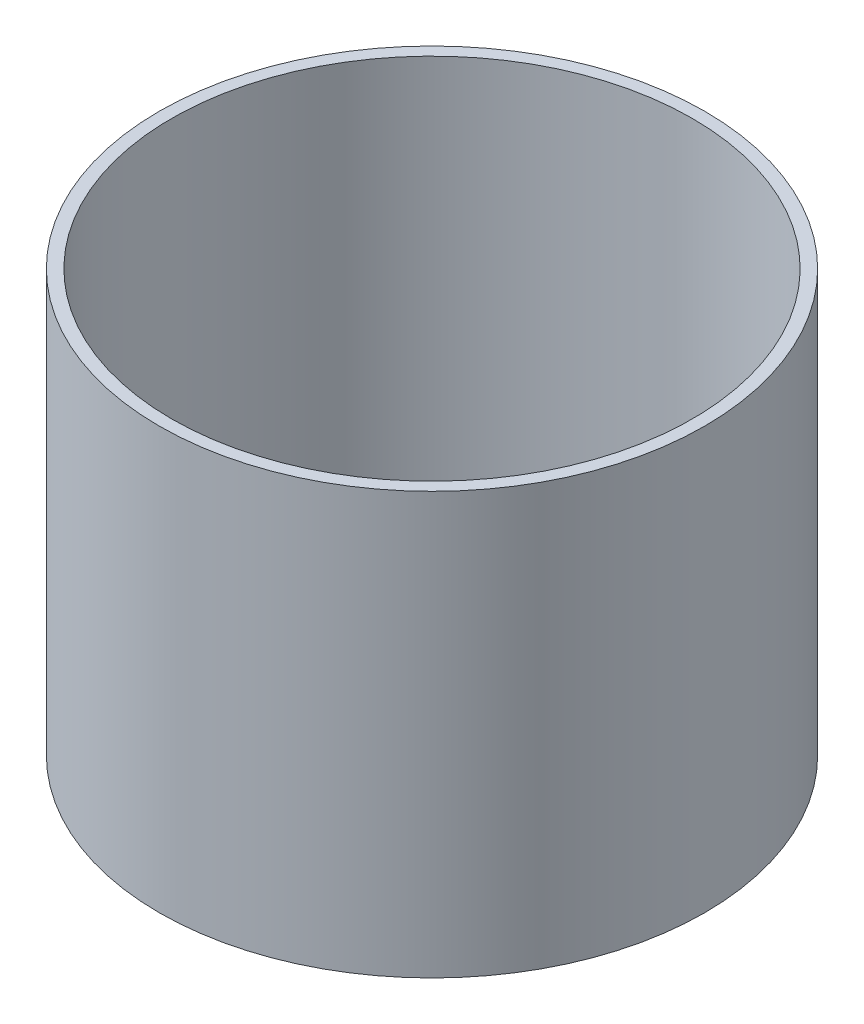
ISO-10303-21;
HEADER;
FILE_DESCRIPTION(('STEP AP214'),'2;1');
FILE_NAME('part.step','',(''),(''),'','','');
FILE_SCHEMA(('AUTOMOTIVE_DESIGN { 1 0 10303 214 1 1 1 1 }'));
ENDSEC;
DATA;
#1=APPLICATION_CONTEXT('core data for automotive mechanical design processes');
#2=APPLICATION_PROTOCOL_DEFINITION('international standard','automotive_design',2000,#1);
#3=PRODUCT_CONTEXT('',#1,'mechanical');
#4=PRODUCT('Part','Part','',(#3));
#5=PRODUCT_RELATED_PRODUCT_CATEGORY('part','',(#4));
#6=PRODUCT_DEFINITION_FORMATION('','',#4);
#7=PRODUCT_DEFINITION_CONTEXT('part definition',#1,'design');
#8=PRODUCT_DEFINITION('design','',#6,#7);
#9=PRODUCT_DEFINITION_SHAPE('','',#8);
#10=(LENGTH_UNIT() NAMED_UNIT(*) SI_UNIT(.MILLI.,.METRE.));
#11=(NAMED_UNIT(*) PLANE_ANGLE_UNIT() SI_UNIT($,.RADIAN.));
#12=(NAMED_UNIT(*) SI_UNIT($,.STERADIAN.) SOLID_ANGLE_UNIT());
#13=UNCERTAINTY_MEASURE_WITH_UNIT(LENGTH_MEASURE(1.E-05),#10,'distance_accuracy_value','');
#14=(GEOMETRIC_REPRESENTATION_CONTEXT(3) GLOBAL_UNCERTAINTY_ASSIGNED_CONTEXT((#13)) GLOBAL_UNIT_ASSIGNED_CONTEXT((#10,
#11,#12)) REPRESENTATION_CONTEXT('',''));
#15=CARTESIAN_POINT('',(0.,0.,0.));
#16=DIRECTION('',(0.,0.,1.));
#17=DIRECTION('',(1.,0.,0.));
#18=AXIS2_PLACEMENT_3D('',#15,#16,#17);
#19=CARTESIAN_POINT('',(0.,17.,0.));
#20=DIRECTION('',(0.,1.,0.));
#21=DIRECTION('',(0.,0.,1.));
#22=AXIS2_PLACEMENT_3D('',#19,#20,#21);
#23=PLANE('',#22);
#24=CARTESIAN_POINT('',(0.,17.,0.));
#25=DIRECTION('',(0.,1.,0.));
#26=DIRECTION('',(0.,0.,1.));
#27=AXIS2_PLACEMENT_3D('',#24,#25,#26);
#28=CIRCLE('',#27,11.);
#29=CARTESIAN_POINT('',(0.,17.,11.));
#30=VERTEX_POINT('',#29);
#31=EDGE_CURVE('E10',#30,#30,#28,.T.);
#32=ORIENTED_EDGE('',*,*,#31,.T.);
#33=EDGE_LOOP('',(#32));
#34=FACE_BOUND('',#33,.T.);
#35=CARTESIAN_POINT('',(0.,17.,0.));
#36=DIRECTION('',(0.,1.,0.));
#37=DIRECTION('',(0.,0.,1.));
#38=AXIS2_PLACEMENT_3D('',#35,#36,#37);
#39=CIRCLE('',#38,10.5);
#40=CARTESIAN_POINT('',(0.,17.,10.5));
#41=VERTEX_POINT('',#40);
#42=EDGE_CURVE('E42',#41,#41,#39,.T.);
#43=ORIENTED_EDGE('',*,*,#42,.F.);
#44=EDGE_LOOP('',(#43));
#45=FACE_BOUND('',#44,.T.);
#46=ADVANCED_FACE('F31',(#34,#45),#23,.T.);
#47=CARTESIAN_POINT('',(0.,0.,0.));
#48=DIRECTION('',(0.,1.,0.));
#49=DIRECTION('',(0.,0.,1.));
#50=AXIS2_PLACEMENT_3D('',#47,#48,#49);
#51=PLANE('',#50);
#52=CARTESIAN_POINT('',(0.,0.,0.));
#53=DIRECTION('',(0.,1.,0.));
#54=DIRECTION('',(0.,0.,1.));
#55=AXIS2_PLACEMENT_3D('',#52,#53,#54);
#56=CIRCLE('',#55,11.);
#57=CARTESIAN_POINT('',(0.,0.,11.));
#58=VERTEX_POINT('',#57);
#59=EDGE_CURVE('E35',#58,#58,#56,.T.);
#60=ORIENTED_EDGE('',*,*,#59,.F.);
#61=EDGE_LOOP('',(#60));
#62=FACE_BOUND('',#61,.T.);
#63=CARTESIAN_POINT('',(0.,0.,0.));
#64=DIRECTION('',(0.,1.,0.));
#65=DIRECTION('',(0.,0.,1.));
#66=AXIS2_PLACEMENT_3D('',#63,#64,#65);
#67=CIRCLE('',#66,10.5);
#68=CARTESIAN_POINT('',(0.,0.,10.5));
#69=VERTEX_POINT('',#68);
#70=EDGE_CURVE('E44',#69,#69,#67,.T.);
#71=ORIENTED_EDGE('',*,*,#70,.T.);
#72=EDGE_LOOP('',(#71));
#73=FACE_BOUND('',#72,.T.);
#74=ADVANCED_FACE('F54',(#62,#73),#51,.F.);
#75=CARTESIAN_POINT('',(0.,17.,0.));
#76=DIRECTION('',(0.,-1.,0.));
#77=DIRECTION('',(0.,0.,-1.));
#78=AXIS2_PLACEMENT_3D('',#75,#76,#77);
#79=CYLINDRICAL_SURFACE('',#78,11.);
#80=ORIENTED_EDGE('',*,*,#31,.F.);
#81=EDGE_LOOP('',(#80));
#82=FACE_BOUND('',#81,.T.);
#83=ORIENTED_EDGE('',*,*,#59,.T.);
#84=EDGE_LOOP('',(#83));
#85=FACE_BOUND('',#84,.T.);
#86=ADVANCED_FACE('F33',(#82,#85),#79,.T.);
#87=CARTESIAN_POINT('',(0.,17.,0.));
#88=DIRECTION('',(0.,-1.,0.));
#89=DIRECTION('',(0.,0.,-1.));
#90=AXIS2_PLACEMENT_3D('',#87,#88,#89);
#91=CYLINDRICAL_SURFACE('',#90,10.5);
#92=ORIENTED_EDGE('',*,*,#42,.T.);
#93=EDGE_LOOP('',(#92));
#94=FACE_BOUND('',#93,.T.);
#95=ORIENTED_EDGE('',*,*,#70,.F.);
#96=EDGE_LOOP('',(#95));
#97=FACE_BOUND('',#96,.T.);
#98=ADVANCED_FACE('F50',(#94,#97),#91,.F.);
#99=CLOSED_SHELL('',(#46,#74,#86,#98));
#100=MANIFOLD_SOLID_BREP('B2',#99);
#101=ADVANCED_BREP_SHAPE_REPRESENTATION('',(#18,#100),#14);
#102=SHAPE_DEFINITION_REPRESENTATION(#9,#101);
ENDSEC;
END-ISO-10303-21;
